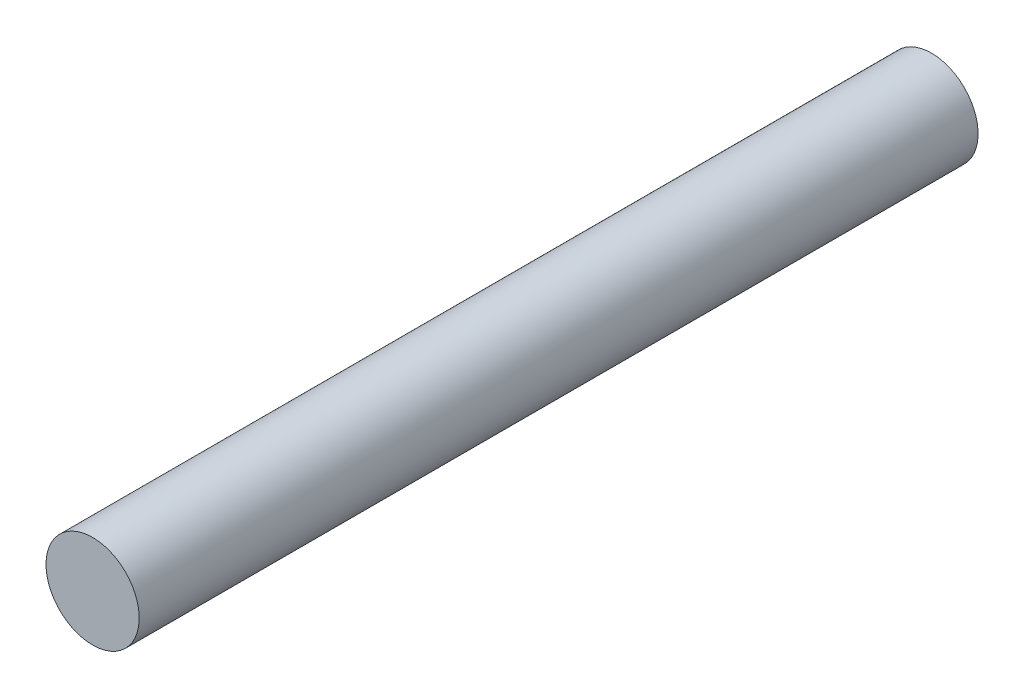
ISO-10303-21;
HEADER;
FILE_DESCRIPTION(('STEP AP214'),'2;1');
FILE_NAME('part.step','',(''),(''),'','','');
FILE_SCHEMA(('AUTOMOTIVE_DESIGN { 1 0 10303 214 1 1 1 1 }'));
ENDSEC;
DATA;
#1=APPLICATION_CONTEXT('core data for automotive mechanical design processes');
#2=APPLICATION_PROTOCOL_DEFINITION('international standard','automotive_design',2000,#1);
#3=PRODUCT_CONTEXT('',#1,'mechanical');
#4=PRODUCT('Part','Part','',(#3));
#5=PRODUCT_RELATED_PRODUCT_CATEGORY('part','',(#4));
#6=PRODUCT_DEFINITION_FORMATION('','',#4);
#7=PRODUCT_DEFINITION_CONTEXT('part definition',#1,'design');
#8=PRODUCT_DEFINITION('design','',#6,#7);
#9=PRODUCT_DEFINITION_SHAPE('','',#8);
#10=(LENGTH_UNIT() NAMED_UNIT(*) SI_UNIT(.MILLI.,.METRE.));
#11=(NAMED_UNIT(*) PLANE_ANGLE_UNIT() SI_UNIT($,.RADIAN.));
#12=(NAMED_UNIT(*) SI_UNIT($,.STERADIAN.) SOLID_ANGLE_UNIT());
#13=UNCERTAINTY_MEASURE_WITH_UNIT(LENGTH_MEASURE(1.E-05),#10,'distance_accuracy_value','');
#14=(GEOMETRIC_REPRESENTATION_CONTEXT(3) GLOBAL_UNCERTAINTY_ASSIGNED_CONTEXT((#13)) GLOBAL_UNIT_ASSIGNED_CONTEXT((#10,
#11,#12)) REPRESENTATION_CONTEXT('',''));
#15=CARTESIAN_POINT('',(0.,0.,0.));
#16=DIRECTION('',(0.,0.,1.));
#17=DIRECTION('',(1.,0.,0.));
#18=AXIS2_PLACEMENT_3D('',#15,#16,#17);
#19=CARTESIAN_POINT('',(0.,0.,90.));
#20=DIRECTION('',(0.,0.,-1.));
#21=DIRECTION('',(-1.,0.,0.));
#22=AXIS2_PLACEMENT_3D('',#19,#20,#21);
#23=CYLINDRICAL_SURFACE('',#22,5.);
#24=CARTESIAN_POINT('',(0.,0.,90.));
#25=DIRECTION('',(0.,0.,1.));
#26=DIRECTION('',(1.,0.,0.));
#27=AXIS2_PLACEMENT_3D('',#24,#25,#26);
#28=CIRCLE('',#27,5.);
#29=CARTESIAN_POINT('',(-5.,0.,90.));
#30=VERTEX_POINT('',#29);
#31=EDGE_CURVE('E10',#30,#30,#28,.T.);
#32=CARTESIAN_POINT('',(0.,0.,0.));
#33=DIRECTION('',(0.,0.,1.));
#34=DIRECTION('',(1.,0.,0.));
#35=AXIS2_PLACEMENT_3D('',#32,#33,#34);
#36=CIRCLE('',#35,5.);
#37=CARTESIAN_POINT('',(-5.,0.,0.));
#38=VERTEX_POINT('',#37);
#39=EDGE_CURVE('E35',#38,#38,#36,.T.);
#40=CARTESIAN_POINT('',(-5.,0.,90.));
#41=CARTESIAN_POINT('',(-5.,0.,89.0625));
#42=CARTESIAN_POINT('',(-5.,0.,88.125));
#43=CARTESIAN_POINT('',(-5.,0.,86.25));
#44=CARTESIAN_POINT('',(-5.,0.,85.3125));
#45=CARTESIAN_POINT('',(-5.,0.,83.4375));
#46=CARTESIAN_POINT('',(-5.,0.,82.5));
#47=CARTESIAN_POINT('',(-5.,0.,80.625));
#48=CARTESIAN_POINT('',(-5.,0.,79.6875));
#49=CARTESIAN_POINT('',(-5.,0.,77.8125));
#50=CARTESIAN_POINT('',(-5.,0.,76.875));
#51=CARTESIAN_POINT('',(-5.,0.,75.));
#52=CARTESIAN_POINT('',(-5.,0.,74.0625));
#53=CARTESIAN_POINT('',(-5.,0.,72.1875));
#54=CARTESIAN_POINT('',(-5.,0.,71.25));
#55=CARTESIAN_POINT('',(-5.,0.,69.375));
#56=CARTESIAN_POINT('',(-5.,0.,68.4375));
#57=CARTESIAN_POINT('',(-5.,0.,66.5625));
#58=CARTESIAN_POINT('',(-5.,0.,65.625));
#59=CARTESIAN_POINT('',(-5.,0.,63.75));
#60=CARTESIAN_POINT('',(-5.,0.,62.8125));
#61=CARTESIAN_POINT('',(-5.,0.,60.9375));
#62=CARTESIAN_POINT('',(-5.,0.,60.));
#63=CARTESIAN_POINT('',(-5.,0.,58.125));
#64=CARTESIAN_POINT('',(-5.,0.,57.1875));
#65=CARTESIAN_POINT('',(-5.,0.,55.3125));
#66=CARTESIAN_POINT('',(-5.,0.,54.375));
#67=CARTESIAN_POINT('',(-5.,0.,52.5));
#68=CARTESIAN_POINT('',(-5.,0.,51.5625));
#69=CARTESIAN_POINT('',(-5.,0.,49.6875));
#70=CARTESIAN_POINT('',(-5.,0.,48.75));
#71=CARTESIAN_POINT('',(-5.,0.,46.875));
#72=CARTESIAN_POINT('',(-5.,0.,45.9375));
#73=CARTESIAN_POINT('',(-5.,0.,44.0625));
#74=CARTESIAN_POINT('',(-5.,0.,43.125));
#75=CARTESIAN_POINT('',(-5.,0.,41.25));
#76=CARTESIAN_POINT('',(-5.,0.,40.3125));
#77=CARTESIAN_POINT('',(-5.,0.,38.4375));
#78=CARTESIAN_POINT('',(-5.,0.,37.5));
#79=CARTESIAN_POINT('',(-5.,0.,35.625));
#80=CARTESIAN_POINT('',(-5.,0.,34.6875));
#81=CARTESIAN_POINT('',(-5.,0.,32.8125));
#82=CARTESIAN_POINT('',(-5.,0.,31.875));
#83=CARTESIAN_POINT('',(-5.,0.,30.));
#84=CARTESIAN_POINT('',(-5.,0.,29.0625));
#85=CARTESIAN_POINT('',(-5.,0.,27.1875));
#86=CARTESIAN_POINT('',(-5.,0.,26.25));
#87=CARTESIAN_POINT('',(-5.,0.,24.375));
#88=CARTESIAN_POINT('',(-5.,0.,23.4375));
#89=CARTESIAN_POINT('',(-5.,0.,21.5625));
#90=CARTESIAN_POINT('',(-5.,0.,20.625));
#91=CARTESIAN_POINT('',(-5.,0.,18.75));
#92=CARTESIAN_POINT('',(-5.,0.,17.8125));
#93=CARTESIAN_POINT('',(-5.,0.,15.9375));
#94=CARTESIAN_POINT('',(-5.,0.,15.));
#95=CARTESIAN_POINT('',(-5.,0.,13.125));
#96=CARTESIAN_POINT('',(-5.,0.,12.1875));
#97=CARTESIAN_POINT('',(-5.,0.,10.3125));
#98=CARTESIAN_POINT('',(-5.,0.,9.37499999999999));
#99=CARTESIAN_POINT('',(-5.,0.,7.49999999999999));
#100=CARTESIAN_POINT('',(-5.,0.,6.56249999999999));
#101=CARTESIAN_POINT('',(-5.,0.,4.68749999999999));
#102=CARTESIAN_POINT('',(-5.,0.,3.74999999999998));
#103=CARTESIAN_POINT('',(-5.,0.,1.87499999999998));
#104=CARTESIAN_POINT('',(-5.,0.,0.937499999999986));
#105=CARTESIAN_POINT('',(-5.,0.,0.));
#106=B_SPLINE_CURVE_WITH_KNOTS('',3,(#40,#41,#42,#43,#44,#45,#46,#47,#48,#49,#50,#51,#52,#53,
#54,#55,#56,#57,#58,#59,#60,#61,#62,#63,#64,#65,#66,#67,#68,#69,#70,#71,#72,#73,#74,#75,#76,#77,
#78,#79,#80,#81,#82,#83,#84,#85,#86,#87,#88,#89,#90,#91,#92,#93,#94,#95,#96,#97,#98,#99,#100,
#101,#102,#103,#104,#105),.UNSPECIFIED.,.F.,.F.,(4,2,2,2,2,2,2,2,2,2,2,2,2,2,2,2,2,2,2,2,2,2,2,
2,2,2,2,2,2,2,2,2,4),(0.,2.8125,5.62499999999999,8.43749999999999,11.25,14.0625,16.875,19.6875,
22.5,25.3125,28.125,30.9375,33.75,36.5625,39.375,42.1875,45.,47.8125,50.625,53.4375,56.25,
59.0625,61.875,64.6875,67.5,70.3125,73.125,75.9375,78.75,81.5625,84.375,87.1875,90.),.UNSPECIFIED.);
#107=EDGE_CURVE('BSEAM32',#30,#38,#106,.T.);
#108=ORIENTED_EDGE('',*,*,#31,.F.);
#109=ORIENTED_EDGE('',*,*,#39,.T.);
#110=ORIENTED_EDGE('',*,*,#107,.T.);
#111=ORIENTED_EDGE('',*,*,#107,.F.);
#112=EDGE_LOOP('',(#108,#110,#109,#111));
#113=FACE_BOUND('',#112,.T.);
#114=ADVANCED_FACE('F32',(#113),#23,.T.);
#115=CARTESIAN_POINT('',(0.,0.,90.));
#116=DIRECTION('',(0.,0.,1.));
#117=DIRECTION('',(1.,0.,0.));
#118=AXIS2_PLACEMENT_3D('',#115,#116,#117);
#119=PLANE('',#118);
#120=ORIENTED_EDGE('',*,*,#31,.T.);
#121=EDGE_LOOP('',(#120));
#122=FACE_BOUND('',#121,.T.);
#123=ADVANCED_FACE('F47',(#122),#119,.T.);
#124=CARTESIAN_POINT('',(0.,0.,0.));
#125=DIRECTION('',(0.,0.,1.));
#126=DIRECTION('',(1.,0.,0.));
#127=AXIS2_PLACEMENT_3D('',#124,#125,#126);
#128=PLANE('',#127);
#129=ORIENTED_EDGE('',*,*,#39,.F.);
#130=EDGE_LOOP('',(#129));
#131=FACE_BOUND('',#130,.T.);
#132=ADVANCED_FACE('F45',(#131),#128,.F.);
#133=CLOSED_SHELL('',(#114,#123,#132));
#134=MANIFOLD_SOLID_BREP('B2',#133);
#135=ADVANCED_BREP_SHAPE_REPRESENTATION('',(#18,#134),#14);
#136=SHAPE_DEFINITION_REPRESENTATION(#9,#135);
ENDSEC;
END-ISO-10303-21;
